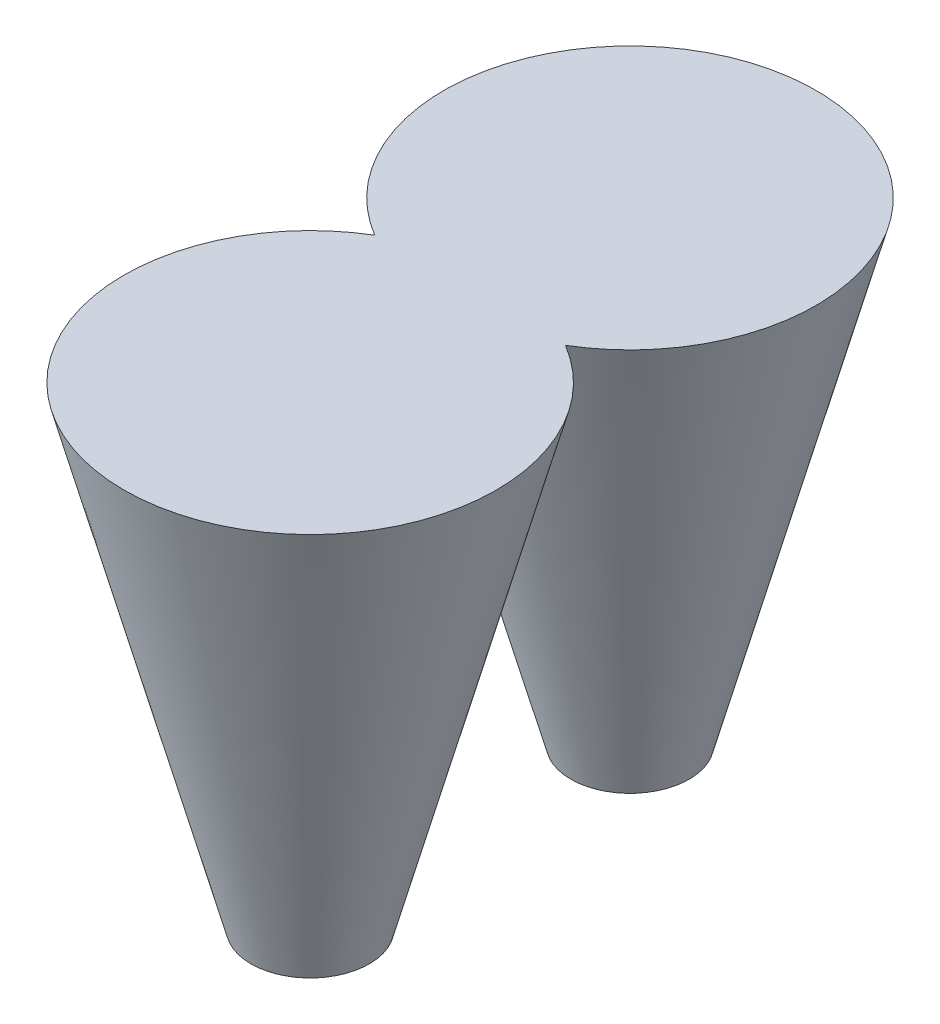
ISO-10303-21;
HEADER;
FILE_DESCRIPTION(('STEP AP214'),'2;1');
FILE_NAME('part.step','',(''),(''),'','','');
FILE_SCHEMA(('AUTOMOTIVE_DESIGN { 1 0 10303 214 1 1 1 1 }'));
ENDSEC;
DATA;
#1=APPLICATION_CONTEXT('core data for automotive mechanical design processes');
#2=APPLICATION_PROTOCOL_DEFINITION('international standard','automotive_design',2000,#1);
#3=PRODUCT_CONTEXT('',#1,'mechanical');
#4=PRODUCT('Part','Part','',(#3));
#5=PRODUCT_RELATED_PRODUCT_CATEGORY('part','',(#4));
#6=PRODUCT_DEFINITION_FORMATION('','',#4);
#7=PRODUCT_DEFINITION_CONTEXT('part definition',#1,'design');
#8=PRODUCT_DEFINITION('design','',#6,#7);
#9=PRODUCT_DEFINITION_SHAPE('','',#8);
#10=(LENGTH_UNIT() NAMED_UNIT(*) SI_UNIT(.MILLI.,.METRE.));
#11=(NAMED_UNIT(*) PLANE_ANGLE_UNIT() SI_UNIT($,.RADIAN.));
#12=(NAMED_UNIT(*) SI_UNIT($,.STERADIAN.) SOLID_ANGLE_UNIT());
#13=UNCERTAINTY_MEASURE_WITH_UNIT(LENGTH_MEASURE(1.E-05),#10,'distance_accuracy_value','');
#14=(GEOMETRIC_REPRESENTATION_CONTEXT(3) GLOBAL_UNCERTAINTY_ASSIGNED_CONTEXT((#13)) GLOBAL_UNIT_ASSIGNED_CONTEXT((#10,
#11,#12)) REPRESENTATION_CONTEXT('',''));
#15=CARTESIAN_POINT('',(0.,0.,0.));
#16=DIRECTION('',(0.,0.,1.));
#17=DIRECTION('',(1.,0.,0.));
#18=AXIS2_PLACEMENT_3D('',#15,#16,#17);
#19=CARTESIAN_POINT('',(0.,0.,0.));
#20=DIRECTION('',(0.,1.,0.));
#21=DIRECTION('',(0.,0.,1.));
#22=AXIS2_PLACEMENT_3D('',#19,#20,#21);
#23=PLANE('',#22);
#24=CARTESIAN_POINT('',(-4000.,0.,550.));
#25=DIRECTION('',(0.,1.,0.));
#26=DIRECTION('',(0.,0.,1.));
#27=AXIS2_PLACEMENT_3D('',#24,#25,#26);
#28=CIRCLE('',#27,500.);
#29=CARTESIAN_POINT('',(-4000.,0.,1050.));
#30=VERTEX_POINT('',#29);
#31=EDGE_CURVE('E69',#30,#30,#28,.T.);
#32=ORIENTED_EDGE('',*,*,#31,.F.);
#33=EDGE_LOOP('',(#32));
#34=FACE_BOUND('',#33,.T.);
#35=ADVANCED_FACE('F41',(#34),#23,.F.);
#36=CARTESIAN_POINT('',(-4000.,0.,550.));
#37=DIRECTION('',(0.,1.,0.));
#38=DIRECTION('',(0.,0.,1.));
#39=AXIS2_PLACEMENT_3D('',#36,#37,#38);
#40=CONICAL_SURFACE('',#39,500.,0.26179938779915);
#41=ORIENTED_EDGE('',*,*,#31,.T.);
#42=EDGE_LOOP('',(#41));
#43=FACE_BOUND('',#42,.T.);
#44=CARTESIAN_POINT('',(-3194.98742011008,4000.0002,-800.));
#45=CARTESIAN_POINT('',(-3199.66066687994,3991.06777472199,-800.));
#46=CARTESIAN_POINT('',(-3204.35743728927,3982.14763925315,-800.));
#47=CARTESIAN_POINT('',(-3213.80014862207,3964.3333859191,-800.));
#48=CARTESIAN_POINT('',(-3218.54608975496,3955.43926816491,-800.));
#49=CARTESIAN_POINT('',(-3228.08944115565,3937.67816393083,-800.));
#50=CARTESIAN_POINT('',(-3232.8868537348,3928.81117869252,-800.));
#51=CARTESIAN_POINT('',(-3242.53520904497,3911.10638605623,-800.));
#52=CARTESIAN_POINT('',(-3247.38615171903,3902.26857862722,-800.));
#53=CARTESIAN_POINT('',(-3257.14864381173,3884.61548557266,-800.));
#54=CARTESIAN_POINT('',(-3262.06024661941,3875.80022946495,-800.));
#55=CARTESIAN_POINT('',(-3271.9421007601,3858.20265328435,-800.));
#56=CARTESIAN_POINT('',(-3276.91235203968,3849.42033318149,-800.));
#57=CARTESIAN_POINT('',(-3286.91422852138,3831.89081905247,-800.));
#58=CARTESIAN_POINT('',(-3291.94585310191,3823.14362467176,-800.));
#59=CARTESIAN_POINT('',(-3302.07349334793,3805.68658067875,-800.));
#60=CARTESIAN_POINT('',(-3307.16950901992,3796.97673107021,-800.));
#61=CARTESIAN_POINT('',(-3317.54258067769,3779.40469107594,-800.));
#62=CARTESIAN_POINT('',(-3322.82114785382,3770.54339243254,-800.));
#63=CARTESIAN_POINT('',(-3333.4525265281,3752.86542651148,-800.));
#64=CARTESIAN_POINT('',(-3338.80533804626,3744.04875924585,-800.));
#65=CARTESIAN_POINT('',(-3349.58921105505,3726.46321824886,-800.));
#66=CARTESIAN_POINT('',(-3355.02027366176,3717.69434520165,-800.));
#67=CARTESIAN_POINT('',(-3365.96480897385,3700.20816252242,-800.));
#68=CARTESIAN_POINT('',(-3371.47828164748,3691.49085287052,-800.));
#69=CARTESIAN_POINT('',(-3382.59012413149,3674.11510476424,-800.));
#70=CARTESIAN_POINT('',(-3388.18846123925,3665.45664540564,-800.));
#71=CARTESIAN_POINT('',(-3399.47700627055,3648.19977415388,-800.));
#72=CARTESIAN_POINT('',(-3405.16721433444,3639.60136235249,-800.));
#73=CARTESIAN_POINT('',(-3416.64472047765,3622.46981152558,-800.));
#74=CARTESIAN_POINT('',(-3422.4320165616,3613.93667116384,-800.));
#75=CARTESIAN_POINT('',(-3434.1095864778,3596.94114930005,-800.));
#76=CARTESIAN_POINT('',(-3439.9998597675,3588.47876742556,-800.));
#77=CARTESIAN_POINT('',(-3450.48584287655,3573.62033627023,-800.));
#78=CARTESIAN_POINT('',(-3455.05879821126,3567.20822170013,-800.));
#79=CARTESIAN_POINT('',(-3464.27148684533,3554.43215683736,-800.));
#80=CARTESIAN_POINT('',(-3468.9112198681,3548.06820634536,-800.));
#81=CARTESIAN_POINT('',(-3478.26071118111,3535.39187728223,-800.));
#82=CARTESIAN_POINT('',(-3482.97046987291,3529.07949900718,-800.));
#83=CARTESIAN_POINT('',(-3492.46341285738,3516.51016411722,-800.));
#84=CARTESIAN_POINT('',(-3497.24659719869,3510.25320753902,-800.));
#85=CARTESIAN_POINT('',(-3506.89255099337,3497.7956869465,-800.));
#86=CARTESIAN_POINT('',(-3511.75536070003,3491.59515408516,-800.));
#87=CARTESIAN_POINT('',(-3521.56201803287,3479.25847149483,-800.));
#88=CARTESIAN_POINT('',(-3526.5058656642,3473.12232176994,-800.));
#89=CARTESIAN_POINT('',(-3536.47869498475,3460.91965121402,-800.));
#90=CARTESIAN_POINT('',(-3541.50767590277,3454.85312975309,-800.));
#91=CARTESIAN_POINT('',(-3551.65521975855,3442.79543258892,-800.));
#92=CARTESIAN_POINT('',(-3556.77378266364,3436.8042568582,-800.));
#93=CARTESIAN_POINT('',(-3567.06958059623,3424.94468068356,-800.));
#94=CARTESIAN_POINT('',(-3572.24616842099,3419.07571874317,-800.));
#95=CARTESIAN_POINT('',(-3582.69717731498,3407.42548002694,-800.));
#96=CARTESIAN_POINT('',(-3587.9715984926,3401.64420334827,-800.));
#97=CARTESIAN_POINT('',(-3598.62387268131,3390.17670331828,-800.));
#98=CARTESIAN_POINT('',(-3604.0017348316,3384.49048844956,-800.));
#99=CARTESIAN_POINT('',(-3614.86581761363,3373.22247983343,-800.));
#100=CARTESIAN_POINT('',(-3620.35203784053,3367.64068569603,-800.));
#101=CARTESIAN_POINT('',(-3631.43325907018,3356.59662878156,-800.));
#102=CARTESIAN_POINT('',(-3637.02815218513,3351.13425785769,-800.));
#103=CARTESIAN_POINT('',(-3648.33769150128,3340.3346126678,-800.));
#104=CARTESIAN_POINT('',(-3654.0523395105,3334.99734029306,-800.));
#105=CARTESIAN_POINT('',(-3665.60609873486,3324.46157555085,-800.));
#106=CARTESIAN_POINT('',(-3671.44518356039,3319.2630542746,-800.));
#107=CARTESIAN_POINT('',(-3683.25478662064,3309.0179041662,-800.));
#108=CARTESIAN_POINT('',(-3689.22529763993,3303.9712670313,-800.));
#109=CARTESIAN_POINT('',(-3700.34462642141,3294.83386087016,-800.));
#110=CARTESIAN_POINT('',(-3705.47331492018,3290.71859526029,-800.));
#111=CARTESIAN_POINT('',(-3715.83149583845,3282.61711937562,-800.));
#112=CARTESIAN_POINT('',(-3721.06098492848,3278.63090484983,-800.));
#113=CARTESIAN_POINT('',(-3731.62422689221,3270.79888425173,-800.));
#114=CARTESIAN_POINT('',(-3736.95798026151,3266.95307884707,-800.));
#115=CARTESIAN_POINT('',(-3747.73276098858,3259.41447236849,-800.));
#116=CARTESIAN_POINT('',(-3753.17378940525,3255.721672806,-800.));
#117=CARTESIAN_POINT('',(-3764.17057367907,3248.49962037761,-800.));
#118=CARTESIAN_POINT('',(-3769.7264294347,3244.97051940082,-800.));
#119=CARTESIAN_POINT('',(-3780.95010678865,3238.09435701474,-800.));
#120=CARTESIAN_POINT('',(-3786.61793217866,3234.74730178462,-800.));
#121=CARTESIAN_POINT('',(-3798.06657382067,3228.25142342874,-800.));
#122=CARTESIAN_POINT('',(-3803.84739479056,3225.10260860339,-800.));
#123=CARTESIAN_POINT('',(-3815.52174372284,3219.02059871711,-800.));
#124=CARTESIAN_POINT('',(-3821.41527425304,3216.08740857604,-800.));
#125=CARTESIAN_POINT('',(-3833.406366151,3210.41091162867,-800.));
#126=CARTESIAN_POINT('',(-3839.50567691839,3207.67129167623,-800.));
#127=CARTESIAN_POINT('',(-3851.81452819596,3202.45348306368,-800.));
#128=CARTESIAN_POINT('',(-3858.02405582931,3199.97526409549,-800.));
#129=CARTESIAN_POINT('',(-3870.54879414312,3195.29982690338,-800.));
#130=CARTESIAN_POINT('',(-3876.86401254401,3193.10262930952,-800.));
#131=CARTESIAN_POINT('',(-3889.59149493265,3189.00930430661,-800.));
#132=CARTESIAN_POINT('',(-3896.00375831857,3187.11317503131,-800.));
#133=CARTESIAN_POINT('',(-3908.89858494391,3183.64513550859,-800.));
#134=CARTESIAN_POINT('',(-3915.38093488225,3182.07243434202,-800.));
#135=CARTESIAN_POINT('',(-3928.4181744717,3179.26230778918,-800.));
#136=CARTESIAN_POINT('',(-3934.97306462717,3178.02488473553,-800.));
#137=CARTESIAN_POINT('',(-3948.13824624132,3175.89982377435,-800.));
#138=CARTESIAN_POINT('',(-3954.74852758841,3175.01212338731,-800.));
#139=CARTESIAN_POINT('',(-3968.00748783523,3173.5970686598,-800.));
#140=CARTESIAN_POINT('',(-3974.65616508384,3173.06969893884,-800.));
#141=CARTESIAN_POINT('',(-3987.10915491435,3172.42645329491,-800.));
#142=CARTESIAN_POINT('',(-3992.91120899614,3172.26610058744,-800.));
#143=CARTESIAN_POINT('',(-4004.5161944264,3172.22484628897,-800.));
#144=CARTESIAN_POINT('',(-4010.31912573938,3172.34393542705,-800.));
#145=CARTESIAN_POINT('',(-4021.91200267378,3172.86037940159,-800.));
#146=CARTESIAN_POINT('',(-4027.70194945039,3173.25770841208,-800.));
#147=CARTESIAN_POINT('',(-4039.25646260654,3174.32677792849,-800.));
#148=CARTESIAN_POINT('',(-4045.02102869368,3174.99852158761,-800.));
#149=CARTESIAN_POINT('',(-4056.51789745679,3176.61089230475,-800.));
#150=CARTESIAN_POINT('',(-4062.25016451297,3177.55177275206,-800.));
#151=CARTESIAN_POINT('',(-4073.66571964263,3179.69367976299,-800.));
#152=CARTESIAN_POINT('',(-4079.3490081209,3180.89470417451,-800.));
#153=CARTESIAN_POINT('',(-4090.65750557949,3183.5468231626,-800.));
#154=CARTESIAN_POINT('',(-4096.28270788773,3184.99794613545,-800.));
#155=CARTESIAN_POINT('',(-4107.46613533599,3188.13859154427,-800.));
#156=CARTESIAN_POINT('',(-4113.02435833154,3189.82812159137,-800.));
#157=CARTESIAN_POINT('',(-4125.33375700947,3193.84667881557,-800.));
#158=CARTESIAN_POINT('',(-4132.06610413994,3196.23349679956,-800.));
#159=CARTESIAN_POINT('',(-4145.4097083716,3201.32443851298,-800.));
#160=CARTESIAN_POINT('',(-4152.02095809559,3204.0285814999,-800.));
#161=CARTESIAN_POINT('',(-4165.11690568195,3209.73011196424,-800.));
#162=CARTESIAN_POINT('',(-4171.60158049352,3212.72755226786,-800.));
#163=CARTESIAN_POINT('',(-4184.43976241741,3218.99142945976,-800.));
#164=CARTESIAN_POINT('',(-4190.79326287898,3222.25787994559,-800.));
#165=CARTESIAN_POINT('',(-4203.37834169558,3229.04262464156,-800.));
#166=CARTESIAN_POINT('',(-4209.60968844731,3232.56134754252,-800.));
#167=CARTESIAN_POINT('',(-4221.9394558468,3239.82392909238,-800.));
#168=CARTESIAN_POINT('',(-4228.03787731698,3243.56778634781,-800.));
#169=CARTESIAN_POINT('',(-4240.10325535684,3251.26033020322,-800.));
#170=CARTESIAN_POINT('',(-4246.07022169399,3255.20900151132,-800.));
#171=CARTESIAN_POINT('',(-4257.87631546231,3263.29322291644,-800.));
#172=CARTESIAN_POINT('',(-4263.71543816474,3267.42877990878,-800.));
#173=CARTESIAN_POINT('',(-4274.91821061762,3275.61343783519,-800.));
#174=CARTESIAN_POINT('',(-4280.28919238521,3279.65252254621,-800.));
#175=CARTESIAN_POINT('',(-4290.92511032777,3287.86832109727,-800.));
#176=CARTESIAN_POINT('',(-4296.19004180894,3292.0450410076,-800.));
#177=CARTESIAN_POINT('',(-4306.61818084169,3300.52524596627,-800.));
#178=CARTESIAN_POINT('',(-4311.78137086666,3304.82875254253,-800.));
#179=CARTESIAN_POINT('',(-4322.00886861819,3313.55146698823,-800.));
#180=CARTESIAN_POINT('',(-4327.07317753735,3317.9706734607,-800.));
#181=CARTESIAN_POINT('',(-4337.11084086267,3326.91905249087,-800.));
#182=CARTESIAN_POINT('',(-4342.08411968099,3331.44830975987,-800.));
#183=CARTESIAN_POINT('',(-4351.93945804357,3340.60495078779,-800.));
#184=CARTESIAN_POINT('',(-4356.82151731355,3345.23233484167,-800.));
#185=CARTESIAN_POINT('',(-4366.49784997372,3354.57723006822,-800.));
#186=CARTESIAN_POINT('',(-4371.29212970401,3359.294734681,-800.));
#187=CARTESIAN_POINT('',(-4380.7969629626,3368.81328128385,-800.));
#188=CARTESIAN_POINT('',(-4385.5075165603,3373.61432320466,-800.));
#189=CARTESIAN_POINT('',(-4394.87804312683,3383.3243292767,-800.));
#190=CARTESIAN_POINT('',(-4399.53750725356,3388.23378416896,-800.));
#191=CARTESIAN_POINT('',(-4408.77878448632,3398.12519790458,-800.));
#192=CARTESIAN_POINT('',(-4413.36059757375,3403.1071567653,-800.));
#193=CARTESIAN_POINT('',(-4422.44993280974,3413.13835371888,-800.));
#194=CARTESIAN_POINT('',(-4426.95745494263,3418.18759182593,-800.));
#195=CARTESIAN_POINT('',(-4435.90143605166,3428.34863035727,-800.));
#196=CARTESIAN_POINT('',(-4440.33789467965,3433.46043108785,-800.));
#197=CARTESIAN_POINT('',(-4449.14064743063,3443.73977286514,-800.));
#198=CARTESIAN_POINT('',(-4453.50697450516,3448.9072857073,-800.));
#199=CARTESIAN_POINT('',(-4462.17455154389,3459.29656159406,-800.));
#200=CARTESIAN_POINT('',(-4466.47580162441,3464.51832454164,-800.));
#201=CARTESIAN_POINT('',(-4475.01600161787,3475.01256043624,-800.));
#202=CARTESIAN_POINT('',(-4479.2549513539,3480.28503352719,-800.));
#203=CARTESIAN_POINT('',(-4487.67315103574,3490.87743972494,-800.));
#204=CARTESIAN_POINT('',(-4491.85240057511,3496.19737315446,-800.));
#205=CARTESIAN_POINT('',(-4503.62461202713,3511.34899280534,-800.));
#206=CARTESIAN_POINT('',(-4511.14977899353,3521.2334458454,-800.));
#207=CARTESIAN_POINT('',(-4526.02147782469,3541.13592779343,-800.));
#208=CARTESIAN_POINT('',(-4533.36800551728,3551.15395981273,-800.));
#209=CARTESIAN_POINT('',(-4547.89577994803,3571.31046478369,-800.));
#210=CARTESIAN_POINT('',(-4555.07701150372,3581.44894867021,-800.));
#211=CARTESIAN_POINT('',(-4569.28503486322,3601.83335585249,-800.));
#212=CARTESIAN_POINT('',(-4576.31182771153,3612.07927842092,-800.));
#213=CARTESIAN_POINT('',(-4590.2277877387,3632.67750512157,-800.));
#214=CARTESIAN_POINT('',(-4597.11682552682,3643.02989660197,-800.));
#215=CARTESIAN_POINT('',(-4610.76033288622,3663.82293848751,-800.));
#216=CARTESIAN_POINT('',(-4617.51480223352,3674.26358903952,-800.));
#217=CARTESIAN_POINT('',(-4630.89751746001,3695.22470255615,-800.));
#218=CARTESIAN_POINT('',(-4637.52576951062,3705.74516158317,-800.));
#219=CARTESIAN_POINT('',(-4650.66429099127,3726.85944075745,-800.));
#220=CARTESIAN_POINT('',(-4657.17456052504,3737.45326084022,-800.));
#221=CARTESIAN_POINT('',(-4669.88619068897,3758.38192318478,-800.));
#222=CARTESIAN_POINT('',(-4676.090899352,3768.71473319246,-800.));
#223=CARTESIAN_POINT('',(-4688.40225087306,3789.43858216447,-800.));
#224=CARTESIAN_POINT('',(-4694.50889375807,3799.82962111279,-800.));
#225=CARTESIAN_POINT('',(-4706.62977597812,3820.66575641335,-800.));
#226=CARTESIAN_POINT('',(-4712.64401313976,3831.11085402938,-800.));
#227=CARTESIAN_POINT('',(-4724.58502509546,3852.05092938597,-800.));
#228=CARTESIAN_POINT('',(-4730.51179973696,3862.5459072135,-800.));
#229=CARTESIAN_POINT('',(-4742.26924197364,3883.5583755656,-800.));
#230=CARTESIAN_POINT('',(-4748.10009666393,3894.07576144096,-800.));
#231=CARTESIAN_POINT('',(-4759.68368791195,3915.15347652703,-800.));
#232=CARTESIAN_POINT('',(-4765.43642432528,3925.71380581709,-800.));
#233=CARTESIAN_POINT('',(-4776.86723773387,3946.873542736,-800.));
#234=CARTESIAN_POINT('',(-4782.54532143978,3957.47294674116,-800.));
#235=CARTESIAN_POINT('',(-4793.83094260412,3978.7091477598,-800.));
#236=CARTESIAN_POINT('',(-4799.43848059648,3989.3459444895,-800.));
#237=CARTESIAN_POINT('',(-4805.01257988992,4000.0002,-800.));
#238=B_SPLINE_CURVE_WITH_KNOTS('',3,(#44,#45,#46,#47,#48,#49,#50,#51,#52,#53,#54,#55,#56,#57,
#58,#59,#60,#61,#62,#63,#64,#65,#66,#67,#68,#69,#70,#71,#72,#73,#74,#75,#76,#77,#78,#79,#80,#81,
#82,#83,#84,#85,#86,#87,#88,#89,#90,#91,#92,#93,#94,#95,#96,#97,#98,#99,#100,#101,#102,#103,
#104,#105,#106,#107,#108,#109,#110,#111,#112,#113,#114,#115,#116,#117,#118,#119,#120,#121,#122,
#123,#124,#125,#126,#127,#128,#129,#130,#131,#132,#133,#134,#135,#136,#137,#138,#139,#140,#141,
#142,#143,#144,#145,#146,#147,#148,#149,#150,#151,#152,#153,#154,#155,#156,#157,#158,#159,#160,
#161,#162,#163,#164,#165,#166,#167,#168,#169,#170,#171,#172,#173,#174,#175,#176,#177,#178,#179,
#180,#181,#182,#183,#184,#185,#186,#187,#188,#189,#190,#191,#192,#193,#194,#195,#196,#197,#198,
#199,#200,#201,#202,#203,#204,#205,#206,#207,#208,#209,#210,#211,#212,#213,#214,#215,#216,#217,
#218,#219,#220,#221,#222,#223,#224,#225,#226,#227,#228,#229,#230,#231,#232,#233,#234,#235,#236,
#237),.UNSPECIFIED.,.F.,.F.,(4,2,2,2,2,2,2,2,2,2,2,2,2,2,2,2,2,2,2,2,2,2,2,2,2,2,2,2,2,2,2,2,2,
2,2,2,2,2,2,2,2,2,2,2,2,2,2,2,2,2,2,2,2,2,2,2,2,2,2,2,2,2,2,2,2,2,2,2,2,2,2,2,2,2,2,2,2,2,2,2,2,
2,2,2,2,2,2,2,2,2,2,2,2,2,2,2,4),(0.,30.243120871985,60.4863706082894,90.7309841688408,
120.975565553818,151.248991518173,181.522389917317,211.795481966482,242.068577073397,
273.011292214208,303.954015697459,334.897180950568,365.840334284978,396.771852359555,
427.703417692407,458.634348095534,489.565115590641,513.191918754498,536.818624085507,
560.44546495913,584.072321486315,607.711515416152,631.350710848035,654.989692257956,
678.62866504771,702.104772102712,725.580905170102,749.05912201252,772.537251153917,
795.993155900892,819.449415034093,842.90074829322,866.350797246106,886.075818850663,
905.800190044209,925.524655016975,945.249314786392,964.991924415567,984.735203749823,
1004.47930919376,1024.2238649961,1044.2771970502,1064.32820146394,1084.38067699901,
1104.43302822953,1124.43574402946,1144.43859898965,1164.43787872917,1184.43630475874,
1201.84257274684,1219.24826326338,1236.65233841252,1254.05661355074,1271.477328859,
1288.89790005573,1306.32045049569,1323.74355727528,1345.16344734084,1366.58463798622,
1388.00969395944,1409.43583356109,1430.89928781323,1452.36260923126,1473.82433045089,
1495.28684417048,1515.4452059911,1535.60445807281,1555.76715307828,1575.92960475039,
1596.10810149943,1616.28665891032,1636.46375307644,1656.64083051647,1676.94561421642,
1697.25040278209,1717.55519563157,1737.86008792834,1758.15514304019,1778.45016187074,
1798.74523832522,1819.0404528882,1856.30699547388,1893.57440759917,1930.84522918967,
1968.11579862758,2005.41987088243,2042.7240052232,2080.02631086423,2117.32858371252,
2153.48583843119,2189.6430832112,2225.80117712583,2261.95933410644,2298.03568768818,
2334.11210795897,2370.18526278833,2406.25814443731),.UNSPECIFIED.);
#239=CARTESIAN_POINT('',(-3194.98752474489,4000.,-800.));
#240=VERTEX_POINT('',#239);
#241=CARTESIAN_POINT('',(-4805.01247525511,4000.,-800.));
#242=VERTEX_POINT('',#241);
#243=EDGE_CURVE('E11',#240,#242,#238,.T.);
#244=ORIENTED_EDGE('',*,*,#243,.F.);
#245=CARTESIAN_POINT('',(-4000.,4000.,550.));
#246=DIRECTION('',(0.,1.,0.));
#247=DIRECTION('',(0.,0.,1.));
#248=AXIS2_PLACEMENT_3D('',#245,#246,#247);
#249=CIRCLE('',#248,1571.79676972449);
#250=EDGE_CURVE('E56',#242,#240,#249,.T.);
#251=ORIENTED_EDGE('',*,*,#250,.F.);
#252=EDGE_LOOP('',(#244,#251));
#253=FACE_BOUND('',#252,.T.);
#254=ADVANCED_FACE('F64',(#43,#253),#40,.T.);
#255=CARTESIAN_POINT('',(0.,4000.,0.));
#256=DIRECTION('',(0.,1.,0.));
#257=DIRECTION('',(0.,0.,1.));
#258=AXIS2_PLACEMENT_3D('',#255,#256,#257);
#259=PLANE('',#258);
#260=ORIENTED_EDGE('',*,*,#250,.T.);
#261=CARTESIAN_POINT('',(-4000.,4000.,-2150.));
#262=DIRECTION('',(0.,1.,0.));
#263=DIRECTION('',(0.,0.,1.));
#264=AXIS2_PLACEMENT_3D('',#261,#262,#263);
#265=CIRCLE('',#264,1571.79676972449);
#266=EDGE_CURVE('E66',#240,#242,#265,.T.);
#267=ORIENTED_EDGE('',*,*,#266,.T.);
#268=EDGE_LOOP('',(#260,#267));
#269=FACE_BOUND('',#268,.T.);
#270=ADVANCED_FACE('F71',(#269),#259,.T.);
#271=CARTESIAN_POINT('',(-4000.,0.,-2150.));
#272=DIRECTION('',(0.,1.,0.));
#273=DIRECTION('',(0.,0.,1.));
#274=AXIS2_PLACEMENT_3D('',#271,#272,#273);
#275=PLANE('',#274);
#276=CARTESIAN_POINT('',(-4000.,0.,-2150.));
#277=DIRECTION('',(0.,1.,0.));
#278=DIRECTION('',(0.,0.,1.));
#279=AXIS2_PLACEMENT_3D('',#276,#277,#278);
#280=CIRCLE('',#279,500.);
#281=CARTESIAN_POINT('',(-4000.,0.,-1650.));
#282=VERTEX_POINT('',#281);
#283=EDGE_CURVE('E70',#282,#282,#280,.T.);
#284=ORIENTED_EDGE('',*,*,#283,.F.);
#285=EDGE_LOOP('',(#284));
#286=FACE_BOUND('',#285,.T.);
#287=ADVANCED_FACE('F83',(#286),#275,.F.);
#288=CARTESIAN_POINT('',(-4000.,0.,-2150.));
#289=DIRECTION('',(0.,1.,0.));
#290=DIRECTION('',(0.,0.,1.));
#291=AXIS2_PLACEMENT_3D('',#288,#289,#290);
#292=CONICAL_SURFACE('',#291,500.,0.26179938779915);
#293=ORIENTED_EDGE('',*,*,#283,.T.);
#294=EDGE_LOOP('',(#293));
#295=FACE_BOUND('',#294,.T.);
#296=ORIENTED_EDGE('',*,*,#266,.F.);
#297=ORIENTED_EDGE('',*,*,#243,.T.);
#298=EDGE_LOOP('',(#296,#297));
#299=FACE_BOUND('',#298,.T.);
#300=ADVANCED_FACE('F43',(#295,#299),#292,.T.);
#301=CLOSED_SHELL('',(#35,#254,#270,#287,#300));
#302=MANIFOLD_SOLID_BREP('B2',#301);
#303=ADVANCED_BREP_SHAPE_REPRESENTATION('',(#18,#302),#14);
#304=SHAPE_DEFINITION_REPRESENTATION(#9,#303);
ENDSEC;
END-ISO-10303-21;
